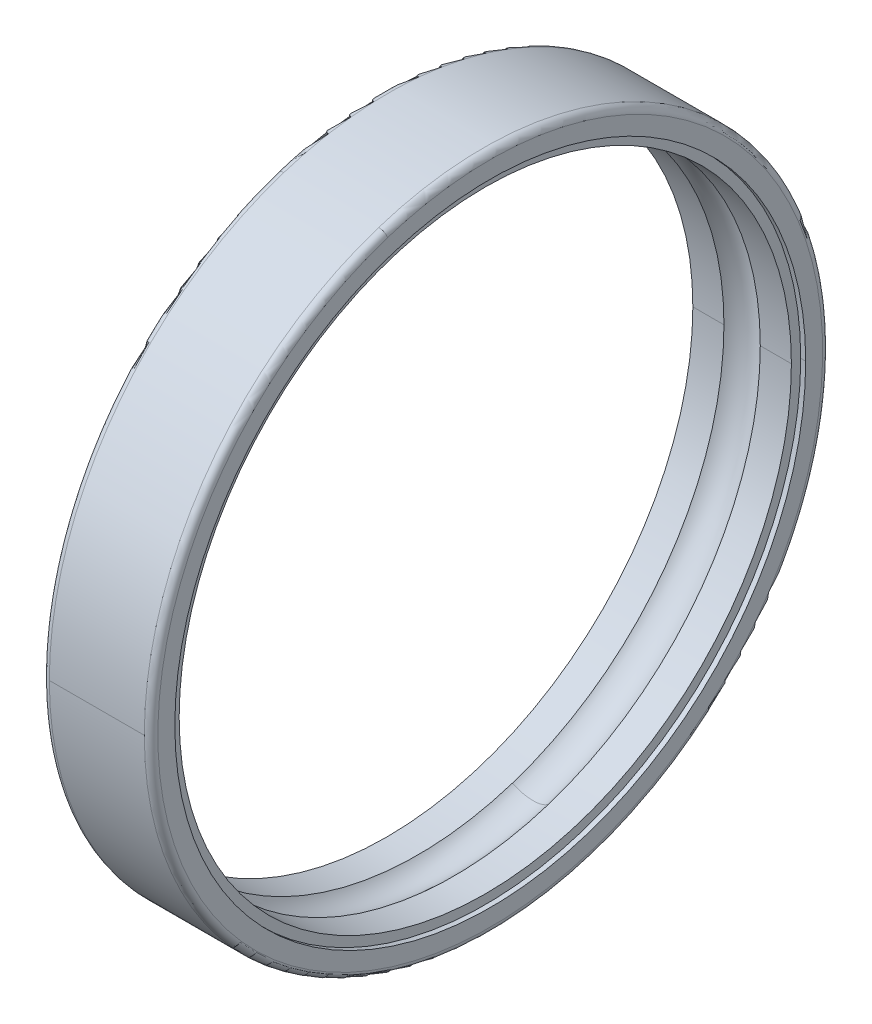
ISO-10303-21;
HEADER;
FILE_DESCRIPTION(('STEP AP214'),'2;1');
FILE_NAME('part.step','',(''),(''),'','','');
FILE_SCHEMA(('AUTOMOTIVE_DESIGN { 1 0 10303 214 1 1 1 1 }'));
ENDSEC;
DATA;
#1=APPLICATION_CONTEXT('core data for automotive mechanical design processes');
#2=APPLICATION_PROTOCOL_DEFINITION('international standard','automotive_design',2000,#1);
#3=PRODUCT_CONTEXT('',#1,'mechanical');
#4=PRODUCT('Part','Part','',(#3));
#5=PRODUCT_RELATED_PRODUCT_CATEGORY('part','',(#4));
#6=PRODUCT_DEFINITION_FORMATION('','',#4);
#7=PRODUCT_DEFINITION_CONTEXT('part definition',#1,'design');
#8=PRODUCT_DEFINITION('design','',#6,#7);
#9=PRODUCT_DEFINITION_SHAPE('','',#8);
#10=(LENGTH_UNIT() NAMED_UNIT(*) SI_UNIT(.MILLI.,.METRE.));
#11=(NAMED_UNIT(*) PLANE_ANGLE_UNIT() SI_UNIT($,.RADIAN.));
#12=(NAMED_UNIT(*) SI_UNIT($,.STERADIAN.) SOLID_ANGLE_UNIT());
#13=UNCERTAINTY_MEASURE_WITH_UNIT(LENGTH_MEASURE(1.E-05),#10,'distance_accuracy_value','');
#14=(GEOMETRIC_REPRESENTATION_CONTEXT(3) GLOBAL_UNCERTAINTY_ASSIGNED_CONTEXT((#13)) GLOBAL_UNIT_ASSIGNED_CONTEXT((#10,
#11,#12)) REPRESENTATION_CONTEXT('',''));
#15=CARTESIAN_POINT('',(0.,0.,0.));
#16=DIRECTION('',(0.,0.,1.));
#17=DIRECTION('',(1.,0.,0.));
#18=AXIS2_PLACEMENT_3D('',#15,#16,#17);
#19=CARTESIAN_POINT('',(0.,49.,0.));
#20=DIRECTION('',(-1.,0.,0.));
#21=DIRECTION('',(0.,0.,1.));
#22=AXIS2_PLACEMENT_3D('',#19,#20,#21);
#23=PLANE('',#22);
#24=CARTESIAN_POINT('',(0.,0.,0.));
#25=DIRECTION('',(1.,0.,0.));
#26=DIRECTION('',(0.,0.,-1.));
#27=AXIS2_PLACEMENT_3D('',#24,#25,#26);
#28=CIRCLE('',#27,46.5);
#29=CARTESIAN_POINT('',(0.,0.,-46.5));
#30=VERTEX_POINT('',#29);
#31=CARTESIAN_POINT('',(0.,0.,46.5));
#32=VERTEX_POINT('',#31);
#33=EDGE_CURVE('E11',#30,#32,#28,.T.);
#34=ORIENTED_EDGE('',*,*,#33,.T.);
#35=CARTESIAN_POINT('',(0.,0.,0.));
#36=DIRECTION('',(1.,0.,0.));
#37=DIRECTION('',(0.,0.,-1.));
#38=AXIS2_PLACEMENT_3D('',#35,#36,#37);
#39=CIRCLE('',#38,46.5);
#40=EDGE_CURVE('E28',#32,#30,#39,.T.);
#41=ORIENTED_EDGE('',*,*,#40,.T.);
#42=EDGE_LOOP('',(#34,#41));
#43=FACE_BOUND('',#42,.T.);
#44=CARTESIAN_POINT('',(0.,46.6017692984632,15.1418327243728));
#45=CARTESIAN_POINT('',(0.,46.3540275646317,15.9043584169981));
#46=CARTESIAN_POINT('',(0.,46.0875394556069,16.6607915214573));
#47=CARTESIAN_POINT('',(0.,45.5177823635672,18.1596768040243));
#48=CARTESIAN_POINT('',(0.,45.2145133805522,18.902128982132));
#49=CARTESIAN_POINT('',(0.,44.5719064169285,20.3712566619767));
#50=CARTESIAN_POINT('',(0.,44.2325684363197,21.0979321637136));
#51=CARTESIAN_POINT('',(0.,43.518645989814,22.5337577730632));
#52=CARTESIAN_POINT('',(0.,43.1440615239171,23.242907880676));
#53=CARTESIAN_POINT('',(0.,42.3605471692183,24.6419737860266));
#54=CARTESIAN_POINT('',(0.,41.9516172804164,25.3318895837645));
#55=CARTESIAN_POINT('',(0.,41.1003975880598,26.6908249387085));
#56=CARTESIAN_POINT('',(0.,40.6581077845053,27.3598444959146));
#57=CARTESIAN_POINT('',(0.,39.7412336809963,28.6753756063925));
#58=CARTESIAN_POINT('',(0.,39.2666493810418,29.3218871596643));
#59=CARTESIAN_POINT('',(0.,38.286329625744,30.5908447691449));
#60=CARTESIAN_POINT('',(0.,37.7805941704005,31.2132908253538));
#61=CARTESIAN_POINT('',(0.,36.7391904584036,32.4326179110054));
#62=CARTESIAN_POINT('',(0.,36.2035222017501,33.029498940448));
#63=CARTESIAN_POINT('',(0.,35.1035433607393,34.1962580345922));
#64=CARTESIAN_POINT('',(0.,34.5392327763819,34.7661360992938));
#65=CARTESIAN_POINT('',(0.,33.3833287530913,35.8775163775936));
#66=CARTESIAN_POINT('',(0.,32.7917353141581,36.4190185911918));
#67=CARTESIAN_POINT('',(0.,31.5826907822608,37.4723426410728));
#68=CARTESIAN_POINT('',(0.,30.9652396892969,37.9841644773557));
#69=CARTESIAN_POINT('',(0.,29.7059673430677,38.9768947489587));
#70=CARTESIAN_POINT('',(0.,29.0641460898025,39.4578031842788));
#71=CARTESIAN_POINT('',(0.,27.7576796265966,40.3875481034166));
#72=CARTESIAN_POINT('',(0.,27.0930344166558,40.8363845872343));
#73=CARTESIAN_POINT('',(0.,25.7425212286229,41.7009043169633));
#74=CARTESIAN_POINT('',(0.,25.0566532505308,42.1165875628746));
#75=CARTESIAN_POINT('',(0.,23.66534684223,42.9137993994422));
#76=CARTESIAN_POINT('',(0.,22.9599084120213,43.2953279900985));
#77=CARTESIAN_POINT('',(0.,21.5311605624548,44.0233113803631));
#78=CARTESIAN_POINT('',(0.,20.8078511430969,44.3697661799714));
#79=CARTESIAN_POINT('',(0.,19.3451038309777,45.026767348182));
#80=CARTESIAN_POINT('',(0.,18.6056659382163,45.3373137167842));
#81=CARTESIAN_POINT('',(0.,17.1124430499408,45.9217498895801));
#82=CARTESIAN_POINT('',(0.,16.3586580544266,46.1956396937737));
#83=CARTESIAN_POINT('',(0.,14.8385568947236,46.7061029132239));
#84=CARTESIAN_POINT('',(0.,14.0722407305346,46.9426763284806));
#85=CARTESIAN_POINT('',(0.,12.5289233562429,47.3779368439784));
#86=CARTESIAN_POINT('',(0.,11.7519221461401,47.5766239442195));
#87=CARTESIAN_POINT('',(0.,10.189106543993,47.9356331750585));
#88=CARTESIAN_POINT('',(0.,9.40329215194865,48.0959553056566));
#89=CARTESIAN_POINT('',(0.,7.8247432816182,48.3778483671544));
#90=CARTESIAN_POINT('',(0.,7.03200880333205,48.4994192980542));
#91=CARTESIAN_POINT('',(0.,5.44152952731147,48.7035170851347));
#92=CARTESIAN_POINT('',(0.,4.64378472957702,48.7860439413154));
#93=CARTESIAN_POINT('',(0.,3.04520665175174,48.9118547645327));
#94=CARTESIAN_POINT('',(0.,2.24437337166092,48.9551387315693));
#95=CARTESIAN_POINT('',(0.,0.641547606639343,49.0023595016304));
#96=CARTESIAN_POINT('',(0.,-0.160444878291403,49.006296304655));
#97=CARTESIAN_POINT('',(0.,-1.76365698285037,48.9748132625889));
#98=CARTESIAN_POINT('',(0.,-2.5648766024786,48.9393934174983));
#99=CARTESIAN_POINT('',(0.,-4.1646127681903,48.8292824087109));
#100=CARTESIAN_POINT('',(0.,-4.96312931427378,48.7545912450142));
#101=CARTESIAN_POINT('',(0.,-6.55553563659467,48.5661175365702));
#102=CARTESIAN_POINT('',(0.,-7.34942541283208,48.452334991823));
#103=CARTESIAN_POINT('',(0.,-8.93066564545337,48.1859526333944));
#104=CARTESIAN_POINT('',(0.,-9.71801610183724,48.0333528197132));
#105=CARTESIAN_POINT('',(0.,-11.2842808985383,47.6897035497339));
#106=CARTESIAN_POINT('',(0.,-12.0631952388554,47.4986540934359));
#107=CARTESIAN_POINT('',(0.,-13.6107113305523,47.0785657930973));
#108=CARTESIAN_POINT('',(0.,-14.379313081932,46.8495269490567));
#109=CARTESIAN_POINT('',(0.,-15.9043523668135,46.3540116478698));
#110=CARTESIAN_POINT('',(0.,-16.6607899003152,46.0875351907234));
#111=CARTESIAN_POINT('',(0.,-18.1596784251663,45.5177866284507));
#112=CARTESIAN_POINT('',(0.,-18.9021294165157,45.2145145233243));
#113=CARTESIAN_POINT('',(0.,-20.3712562275929,44.5719052741564));
#114=CARTESIAN_POINT('',(0.,-21.0979320473208,44.2325681301148));
#115=CARTESIAN_POINT('',(0.,-22.533757889456,43.5186462960189));
#116=CARTESIAN_POINT('',(0.,-23.2429079118633,43.1440616059645));
#117=CARTESIAN_POINT('',(0.,-24.6419737548392,42.360547087171));
#118=CARTESIAN_POINT('',(0.,-25.3318895754078,41.9516172584319));
#119=CARTESIAN_POINT('',(0.,-26.6908249470651,41.1003976100444));
#120=CARTESIAN_POINT('',(0.,-27.3598444981537,40.658107790396));
#121=CARTESIAN_POINT('',(0.,-28.6753756041533,39.7412336751056));
#122=CARTESIAN_POINT('',(0.,-29.3218871590642,39.2666493794635));
#123=CARTESIAN_POINT('',(0.,-30.5908447697449,38.2863296273224));
#124=CARTESIAN_POINT('',(0.,-31.2132908255146,37.7805941708235));
#125=CARTESIAN_POINT('',(0.,-32.4326179108446,36.7391904579807));
#126=CARTESIAN_POINT('',(0.,-33.0294989404049,36.2035222016368));
#127=CARTESIAN_POINT('',(0.,-34.1962580346352,35.1035433608526));
#128=CARTESIAN_POINT('',(0.,-34.7661360993053,34.5392327764123));
#129=CARTESIAN_POINT('',(0.,-35.877516377582,33.383328753061));
#130=CARTESIAN_POINT('',(0.,-36.4190185911886,32.79173531415));
#131=CARTESIAN_POINT('',(0.,-37.4723426410759,31.582690782269));
#132=CARTESIAN_POINT('',(0.,-37.9841644773565,30.9652396892991));
#133=CARTESIAN_POINT('',(0.,-38.9768947489578,29.7059673430655));
#134=CARTESIAN_POINT('',(0.,-39.4578031842786,29.064146089802));
#135=CARTESIAN_POINT('',(0.,-40.3875481034168,27.7576796265972));
#136=CARTESIAN_POINT('',(0.,-40.8363845872343,27.093034416656));
#137=CARTESIAN_POINT('',(0.,-41.7009043169632,25.7425212286228));
#138=CARTESIAN_POINT('',(0.,-42.1165875628746,25.0566532505308));
#139=CARTESIAN_POINT('',(0.,-42.9137993994422,23.6653468422301));
#140=CARTESIAN_POINT('',(0.,-43.2953279900985,22.9599084120214));
#141=CARTESIAN_POINT('',(0.,-44.023311380363,21.5311605624549));
#142=CARTESIAN_POINT('',(0.,-44.3697661799713,20.807851143097));
#143=CARTESIAN_POINT('',(0.,-45.026767348182,19.3451038309777));
#144=CARTESIAN_POINT('',(0.,-45.3373137167844,18.6056659382163));
#145=CARTESIAN_POINT('',(0.,-45.9217498895799,17.1124430499409));
#146=CARTESIAN_POINT('',(0.,-46.195639693773,16.3586580544268));
#147=CARTESIAN_POINT('',(0.,-46.7061029132245,14.8385568947234));
#148=CARTESIAN_POINT('',(0.,-46.9426763284829,14.0722407305341));
#149=CARTESIAN_POINT('',(0.,-47.3779368439761,12.5289233562436));
#150=CARTESIAN_POINT('',(0.,-47.5766239442111,11.7519221461424));
#151=CARTESIAN_POINT('',(0.,-47.9356331750669,10.1891065439907));
#152=CARTESIAN_POINT('',(0.,-48.0959553056879,9.4032921519402));
#153=CARTESIAN_POINT('',(0.,-48.3778483671231,7.82474328162676));
#154=CARTESIAN_POINT('',(0.,-48.4994192979372,7.03200880336386));
#155=CARTESIAN_POINT('',(0.,-48.7035170852517,5.44152952727973));
#156=CARTESIAN_POINT('',(0.,-48.7860439417521,4.64378472945851));
#157=CARTESIAN_POINT('',(0.,-48.911854764096,3.04520665187031));
#158=CARTESIAN_POINT('',(0.,-48.9551387299396,2.24437337210333));
#159=CARTESIAN_POINT('',(0.,-49.00235950326,0.641547606197012));
#160=CARTESIAN_POINT('',(0.,-49.0062963107369,-0.160444879942331));
#161=CARTESIAN_POINT('',(0.,-48.9748132565071,-1.76365698119935));
#162=CARTESIAN_POINT('',(0.,-48.9393933948005,-2.56487659631703));
#163=CARTESIAN_POINT('',(0.,-48.8292824314086,-4.16461277435179));
#164=CARTESIAN_POINT('',(0.,-48.7545913297233,-4.96312933726887));
#165=CARTESIAN_POINT('',(0.,-48.566117451861,-6.55553561359952));
#166=CARTESIAN_POINT('',(0.,-48.4523346756841,-7.34942532701308));
#167=CARTESIAN_POINT('',(0.,-48.1859529495333,-8.93066573127231));
#168=CARTESIAN_POINT('',(0.,-48.0333539995595,-9.71801642211798));
#169=CARTESIAN_POINT('',(0.,-47.6897023698875,-11.2842805782574));
#170=CARTESIAN_POINT('',(0.,-47.4986496901892,-12.0631940435512));
#171=CARTESIAN_POINT('',(0.,-47.0785701963439,-13.6107125258564));
#172=CARTESIAN_POINT('',(0.,-46.8495433821969,-14.3793175428678));
#173=CARTESIAN_POINT('',(0.,-46.6017692984633,-15.1418327243727));
#174=B_SPLINE_CURVE_WITH_KNOTS('',3,(#44,#45,#46,#47,#48,#49,#50,#51,#52,#53,#54,#55,#56,#57,
#58,#59,#60,#61,#62,#63,#64,#65,#66,#67,#68,#69,#70,#71,#72,#73,#74,#75,#76,#77,#78,#79,#80,#81,
#82,#83,#84,#85,#86,#87,#88,#89,#90,#91,#92,#93,#94,#95,#96,#97,#98,#99,#100,#101,#102,#103,
#104,#105,#106,#107,#108,#109,#110,#111,#112,#113,#114,#115,#116,#117,#118,#119,#120,#121,#122,
#123,#124,#125,#126,#127,#128,#129,#130,#131,#132,#133,#134,#135,#136,#137,#138,#139,#140,#141,
#142,#143,#144,#145,#146,#147,#148,#149,#150,#151,#152,#153,#154,#155,#156,#157,#158,#159,#160,
#161,#162,#163,#164,#165,#166,#167,#168,#169,#170,#171,#172,#173),.UNSPECIFIED.,.F.,.F.,(4,2,2,
2,2,2,2,2,2,2,2,2,2,2,2,2,2,2,2,2,2,2,2,2,2,2,2,2,2,2,2,2,2,2,2,2,2,2,2,2,2,2,2,2,2,2,2,2,2,2,2,
2,2,2,2,2,2,2,2,2,2,2,2,2,4),(0.,2.40504039524543,4.81008079049088,7.21512118573632,
9.62016158098177,12.0252019762272,14.4302423714727,16.8352827667181,19.2403231619636,
21.645363557209,24.0504039524544,26.4554443476999,28.8604847429453,31.2655251381908,
33.6705655334362,36.0756059286816,38.4806463239271,40.8856867191725,43.290727114418,
45.6957675096634,48.1008079049088,50.5058483001543,52.9108886953997,55.3159290906452,
57.7209694858906,60.1260098811361,62.5310502763815,64.9360906716269,67.3411310668724,
69.7461714621178,72.1512118573633,74.5562522526087,76.9612926478542,79.3663330430996,
81.771373438345,84.1764138335905,86.5814542288359,88.9864946240814,91.3915350193268,
93.7965754145722,96.2016158098177,98.6066562050631,101.011696600309,103.416736995554,
105.821777390799,108.226817786045,110.63185818129,113.036898576536,115.441938971781,
117.846979367027,120.252019762272,122.657060157518,125.062100552763,127.467140948008,
129.872181343254,132.277221738499,134.682262133745,137.08730252899,139.492342924236,
141.897383319481,144.302423714727,146.707464109972,149.112504505217,151.517544900463,
153.922585295708),.UNSPECIFIED.);
#175=CARTESIAN_POINT('',(0.,46.6017692984633,15.1418327243727));
#176=VERTEX_POINT('',#175);
#177=CARTESIAN_POINT('',(0.,-46.6017692984633,-15.1418327243727));
#178=VERTEX_POINT('',#177);
#179=EDGE_CURVE('E320',#176,#178,#174,.T.);
#180=ORIENTED_EDGE('',*,*,#179,.F.);
#181=CARTESIAN_POINT('',(0.,-46.6017692984632,-15.1418327243728));
#182=CARTESIAN_POINT('',(0.,-46.3540275646317,-15.9043584169981));
#183=CARTESIAN_POINT('',(0.,-46.0875394556069,-16.6607915214573));
#184=CARTESIAN_POINT('',(0.,-45.5177823635672,-18.1596768040243));
#185=CARTESIAN_POINT('',(0.,-45.2145133805522,-18.902128982132));
#186=CARTESIAN_POINT('',(0.,-44.5719064169285,-20.3712566619767));
#187=CARTESIAN_POINT('',(0.,-44.2325684363197,-21.0979321637136));
#188=CARTESIAN_POINT('',(0.,-43.518645989814,-22.5337577730632));
#189=CARTESIAN_POINT('',(0.,-43.1440615239171,-23.242907880676));
#190=CARTESIAN_POINT('',(0.,-42.3605471692183,-24.6419737860266));
#191=CARTESIAN_POINT('',(0.,-41.9516172804164,-25.3318895837645));
#192=CARTESIAN_POINT('',(0.,-41.1003975880598,-26.6908249387085));
#193=CARTESIAN_POINT('',(0.,-40.6581077845053,-27.3598444959146));
#194=CARTESIAN_POINT('',(0.,-39.7412336809963,-28.6753756063925));
#195=CARTESIAN_POINT('',(0.,-39.2666493810419,-29.3218871596642));
#196=CARTESIAN_POINT('',(0.,-38.286329625744,-30.5908447691449));
#197=CARTESIAN_POINT('',(0.,-37.7805941704005,-31.2132908253538));
#198=CARTESIAN_POINT('',(0.,-36.7391904584036,-32.4326179110054));
#199=CARTESIAN_POINT('',(0.,-36.2035222017501,-33.029498940448));
#200=CARTESIAN_POINT('',(0.,-35.1035433607393,-34.1962580345922));
#201=CARTESIAN_POINT('',(0.,-34.5392327763819,-34.7661360992938));
#202=CARTESIAN_POINT('',(0.,-33.3833287530914,-35.8775163775935));
#203=CARTESIAN_POINT('',(0.,-32.7917353141581,-36.4190185911917));
#204=CARTESIAN_POINT('',(0.,-31.5826907822609,-37.4723426410728));
#205=CARTESIAN_POINT('',(0.,-30.9652396892969,-37.9841644773557));
#206=CARTESIAN_POINT('',(0.,-29.7059673430677,-38.9768947489587));
#207=CARTESIAN_POINT('',(0.,-29.0641460898026,-39.4578031842788));
#208=CARTESIAN_POINT('',(0.,-27.7576796265966,-40.3875481034166));
#209=CARTESIAN_POINT('',(0.,-27.0930344166559,-40.8363845872342));
#210=CARTESIAN_POINT('',(0.,-25.7425212286229,-41.7009043169632));
#211=CARTESIAN_POINT('',(0.,-25.0566532505308,-42.1165875628746));
#212=CARTESIAN_POINT('',(0.,-23.66534684223,-42.9137993994422));
#213=CARTESIAN_POINT('',(0.,-22.9599084120214,-43.2953279900985));
#214=CARTESIAN_POINT('',(0.,-21.5311605624549,-44.0233113803631));
#215=CARTESIAN_POINT('',(0.,-20.807851143097,-44.3697661799714));
#216=CARTESIAN_POINT('',(0.,-19.3451038309777,-45.0267673481819));
#217=CARTESIAN_POINT('',(0.,-18.6056659382163,-45.3373137167842));
#218=CARTESIAN_POINT('',(0.,-17.1124430499408,-45.9217498895801));
#219=CARTESIAN_POINT('',(0.,-16.3586580544267,-46.1956396937736));
#220=CARTESIAN_POINT('',(0.,-14.8385568947236,-46.7061029132239));
#221=CARTESIAN_POINT('',(0.,-14.0722407305347,-46.9426763284806));
#222=CARTESIAN_POINT('',(0.,-12.5289233562429,-47.3779368439784));
#223=CARTESIAN_POINT('',(0.,-11.7519221461401,-47.5766239442194));
#224=CARTESIAN_POINT('',(0.,-10.189106543993,-47.9356331750585));
#225=CARTESIAN_POINT('',(0.,-9.40329215194871,-48.0959553056566));
#226=CARTESIAN_POINT('',(0.,-7.82474328161827,-48.3778483671544));
#227=CARTESIAN_POINT('',(0.,-7.03200880333212,-48.4994192980542));
#228=CARTESIAN_POINT('',(0.,-5.44152952731154,-48.7035170851347));
#229=CARTESIAN_POINT('',(0.,-4.64378472957709,-48.7860439413154));
#230=CARTESIAN_POINT('',(0.,-3.04520665175181,-48.9118547645327));
#231=CARTESIAN_POINT('',(0.,-2.24437337166097,-48.9551387315693));
#232=CARTESIAN_POINT('',(0.,-0.641547606639399,-49.0023595016304));
#233=CARTESIAN_POINT('',(0.,0.16044487829134,-49.006296304655));
#234=CARTESIAN_POINT('',(0.,1.7636569828503,-48.9748132625889));
#235=CARTESIAN_POINT('',(0.,2.56487660247853,-48.9393934174983));
#236=CARTESIAN_POINT('',(0.,4.16461276819022,-48.8292824087109));
#237=CARTESIAN_POINT('',(0.,4.96312931427369,-48.7545912450141));
#238=CARTESIAN_POINT('',(0.,6.55553563659458,-48.5661175365702));
#239=CARTESIAN_POINT('',(0.,7.34942541283199,-48.452334991823));
#240=CARTESIAN_POINT('',(0.,8.93066564545328,-48.1859526333945));
#241=CARTESIAN_POINT('',(0.,9.71801610183715,-48.0333528197132));
#242=CARTESIAN_POINT('',(0.,11.2842808985382,-47.6897035497339));
#243=CARTESIAN_POINT('',(0.,12.0631952388553,-47.4986540934359));
#244=CARTESIAN_POINT('',(0.,13.6107113305522,-47.0785657930973));
#245=CARTESIAN_POINT('',(0.,14.3793130819319,-46.8495269490568));
#246=CARTESIAN_POINT('',(0.,15.9043523668134,-46.3540116478698));
#247=CARTESIAN_POINT('',(0.,16.6607899003151,-46.0875351907235));
#248=CARTESIAN_POINT('',(0.,18.1596784251662,-45.5177866284507));
#249=CARTESIAN_POINT('',(0.,18.9021294165156,-45.2145145233244));
#250=CARTESIAN_POINT('',(0.,20.3712562275928,-44.5719052741564));
#251=CARTESIAN_POINT('',(0.,21.0979320473207,-44.2325681301148));
#252=CARTESIAN_POINT('',(0.,22.5337578894559,-43.5186462960189));
#253=CARTESIAN_POINT('',(0.,23.2429079118632,-43.1440616059645));
#254=CARTESIAN_POINT('',(0.,24.6419737548391,-42.360547087171));
#255=CARTESIAN_POINT('',(0.,25.3318895754077,-41.9516172584319));
#256=CARTESIAN_POINT('',(0.,26.690824947065,-41.1003976100445));
#257=CARTESIAN_POINT('',(0.,27.3598444981536,-40.6581077903961));
#258=CARTESIAN_POINT('',(0.,28.6753756041532,-39.7412336751056));
#259=CARTESIAN_POINT('',(0.,29.3218871590641,-39.2666493794635));
#260=CARTESIAN_POINT('',(0.,30.5908447697448,-38.2863296273225));
#261=CARTESIAN_POINT('',(0.,31.2132908255145,-37.7805941708236));
#262=CARTESIAN_POINT('',(0.,32.4326179108445,-36.7391904579807));
#263=CARTESIAN_POINT('',(0.,33.0294989404048,-36.2035222016369));
#264=CARTESIAN_POINT('',(0.,34.1962580346351,-35.1035433608527));
#265=CARTESIAN_POINT('',(0.,34.7661360993052,-34.5392327764124));
#266=CARTESIAN_POINT('',(0.,35.8775163775819,-33.3833287530611));
#267=CARTESIAN_POINT('',(0.,36.4190185911885,-32.7917353141501));
#268=CARTESIAN_POINT('',(0.,37.4723426410758,-31.5826907822691));
#269=CARTESIAN_POINT('',(0.,37.9841644773564,-30.9652396892992));
#270=CARTESIAN_POINT('',(0.,38.9768947489578,-29.7059673430656));
#271=CARTESIAN_POINT('',(0.,39.4578031842785,-29.0641460898021));
#272=CARTESIAN_POINT('',(0.,40.3875481034167,-27.7576796265973));
#273=CARTESIAN_POINT('',(0.,40.8363845872342,-27.0930344166561));
#274=CARTESIAN_POINT('',(0.,41.7009043169631,-25.7425212286229));
#275=CARTESIAN_POINT('',(0.,42.1165875628745,-25.0566532505309));
#276=CARTESIAN_POINT('',(0.,42.9137993994421,-23.6653468422302));
#277=CARTESIAN_POINT('',(0.,43.2953279900984,-22.9599084120215));
#278=CARTESIAN_POINT('',(0.,44.023311380363,-21.531160562455));
#279=CARTESIAN_POINT('',(0.,44.3697661799713,-20.8078511430971));
#280=CARTESIAN_POINT('',(0.,45.026767348182,-19.3451038309778));
#281=CARTESIAN_POINT('',(0.,45.3373137167843,-18.6056659382164));
#282=CARTESIAN_POINT('',(0.,45.9217498895798,-17.112443049941));
#283=CARTESIAN_POINT('',(0.,46.195639693773,-16.358658054427));
#284=CARTESIAN_POINT('',(0.,46.7061029132245,-14.8385568947236));
#285=CARTESIAN_POINT('',(0.,46.9426763284828,-14.0722407305342));
#286=CARTESIAN_POINT('',(0.,47.3779368439761,-12.5289233562437));
#287=CARTESIAN_POINT('',(0.,47.576623944211,-11.7519221461425));
#288=CARTESIAN_POINT('',(0.,47.9356331750669,-10.1891065439909));
#289=CARTESIAN_POINT('',(0.,48.0959553056879,-9.40329215194033));
#290=CARTESIAN_POINT('',(0.,48.377848367123,-7.82474328162691));
#291=CARTESIAN_POINT('',(0.,48.4994192979372,-7.03200880336402));
#292=CARTESIAN_POINT('',(0.,48.7035170852517,-5.44152952727991));
#293=CARTESIAN_POINT('',(0.,48.7860439417521,-4.64378472945869));
#294=CARTESIAN_POINT('',(0.,48.911854764096,-3.04520665187049));
#295=CARTESIAN_POINT('',(0.,48.9551387299396,-2.24437337210351));
#296=CARTESIAN_POINT('',(0.,49.00235950326,-0.641547606197191));
#297=CARTESIAN_POINT('',(0.,49.0062963107369,0.16044487994215));
#298=CARTESIAN_POINT('',(0.,48.9748132565071,1.76365698119917));
#299=CARTESIAN_POINT('',(0.,48.9393933948005,2.56487659631685));
#300=CARTESIAN_POINT('',(0.,48.8292824314086,4.16461277435161));
#301=CARTESIAN_POINT('',(0.,48.7545913297233,4.96312933726869));
#302=CARTESIAN_POINT('',(0.,48.5661174518611,6.55553561359934));
#303=CARTESIAN_POINT('',(0.,48.4523346756841,7.3494253270129));
#304=CARTESIAN_POINT('',(0.,48.1859529495334,8.93066573127214));
#305=CARTESIAN_POINT('',(0.,48.0333539995596,9.71801642211781));
#306=CARTESIAN_POINT('',(0.,47.6897023698875,11.2842805782573));
#307=CARTESIAN_POINT('',(0.,47.4986496901893,12.063194043551));
#308=CARTESIAN_POINT('',(0.,47.078570196344,13.6107125258562));
#309=CARTESIAN_POINT('',(0.,46.8495433821969,14.3793175428676));
#310=CARTESIAN_POINT('',(0.,46.6017692984633,15.1418327243725));
#311=B_SPLINE_CURVE_WITH_KNOTS('',3,(#181,#182,#183,#184,#185,#186,#187,#188,#189,#190,#191,
#192,#193,#194,#195,#196,#197,#198,#199,#200,#201,#202,#203,#204,#205,#206,#207,#208,#209,#210,
#211,#212,#213,#214,#215,#216,#217,#218,#219,#220,#221,#222,#223,#224,#225,#226,#227,#228,#229,
#230,#231,#232,#233,#234,#235,#236,#237,#238,#239,#240,#241,#242,#243,#244,#245,#246,#247,#248,
#249,#250,#251,#252,#253,#254,#255,#256,#257,#258,#259,#260,#261,#262,#263,#264,#265,#266,#267,
#268,#269,#270,#271,#272,#273,#274,#275,#276,#277,#278,#279,#280,#281,#282,#283,#284,#285,#286,
#287,#288,#289,#290,#291,#292,#293,#294,#295,#296,#297,#298,#299,#300,#301,#302,#303,#304,#305,
#306,#307,#308,#309,#310),.UNSPECIFIED.,.F.,.F.,(4,2,2,2,2,2,2,2,2,2,2,2,2,2,2,2,2,2,2,2,2,2,2,
2,2,2,2,2,2,2,2,2,2,2,2,2,2,2,2,2,2,2,2,2,2,2,2,2,2,2,2,2,2,2,2,2,2,2,2,2,2,2,2,2,4),(0.,
2.40504039524543,4.81008079049088,7.21512118573632,9.62016158098176,12.0252019762272,
14.4302423714726,16.8352827667181,19.2403231619635,21.645363557209,24.0504039524544,
26.4554443476998,28.8604847429453,31.2655251381907,33.6705655334361,36.0756059286816,
38.480646323927,40.8856867191725,43.2907271144179,45.6957675096633,48.1008079049088,
50.5058483001542,52.9108886953997,55.3159290906451,57.7209694858905,60.126009881136,
62.5310502763814,64.9360906716269,67.3411310668723,69.7461714621177,72.1512118573632,
74.5562522526086,76.9612926478541,79.3663330430995,81.7713734383449,84.1764138335904,
86.5814542288358,88.9864946240812,91.3915350193267,93.7965754145721,96.2016158098176,
98.606656205063,101.011696600308,103.416736995554,105.821777390799,108.226817786045,
110.63185818129,113.036898576536,115.441938971781,117.846979367027,120.252019762272,
122.657060157517,125.062100552763,127.467140948008,129.872181343254,132.277221738499,
134.682262133745,137.08730252899,139.492342924236,141.897383319481,144.302423714726,
146.707464109972,149.112504505217,151.517544900463,153.922585295708),.UNSPECIFIED.);
#312=EDGE_CURVE('E422',#178,#176,#311,.T.);
#313=ORIENTED_EDGE('',*,*,#312,.F.);
#314=EDGE_LOOP('',(#180,#313));
#315=FACE_BOUND('',#314,.T.);
#316=ADVANCED_FACE('F19',(#43,#315),#23,.T.);
#317=CARTESIAN_POINT('',(0.999999999999218,0.,0.));
#318=DIRECTION('',(1.,0.,0.));
#319=DIRECTION('',(0.,-0.309016994374947,0.951056516295154));
#320=AXIS2_PLACEMENT_3D('',#317,#318,#319);
#321=TOROIDAL_SURFACE('',#320,49.0000000000008,0.999999999999217);
#322=CARTESIAN_POINT('',(0.999999999999218,-46.6017692984633,-15.1418327243727));
#323=DIRECTION('',(0.,0.309016994374947,-0.951056516295154));
#324=DIRECTION('',(7.81819053941643E-13,-0.951056516295154,-0.309016994374947));
#325=AXIS2_PLACEMENT_3D('',#322,#323,#324);
#326=CIRCLE('',#325,0.999999999999223);
#327=CARTESIAN_POINT('',(1.,-47.5528258147577,-15.4508497187474));
#328=VERTEX_POINT('',#327);
#329=EDGE_CURVE('E385',#328,#178,#326,.T.);
#330=ORIENTED_EDGE('',*,*,#329,.T.);
#331=ORIENTED_EDGE('',*,*,#312,.T.);
#332=CARTESIAN_POINT('',(0.999999999999218,46.6017692984633,15.1418327243727));
#333=DIRECTION('',(0.,-0.309016994374947,0.951056516295154));
#334=DIRECTION('',(7.81819053941643E-13,0.951056516295154,0.309016994374947));
#335=AXIS2_PLACEMENT_3D('',#332,#333,#334);
#336=CIRCLE('',#335,0.999999999999223);
#337=CARTESIAN_POINT('',(1.,47.5528258147577,15.4508497187474));
#338=VERTEX_POINT('',#337);
#339=EDGE_CURVE('E381',#338,#176,#336,.T.);
#340=ORIENTED_EDGE('',*,*,#339,.F.);
#341=CARTESIAN_POINT('',(1.,0.,0.));
#342=DIRECTION('',(1.,0.,0.));
#343=DIRECTION('',(0.,0.,-1.));
#344=AXIS2_PLACEMENT_3D('',#341,#342,#343);
#345=CIRCLE('',#344,50.);
#346=CARTESIAN_POINT('',(1.,0.,-50.));
#347=VERTEX_POINT('',#346);
#348=EDGE_CURVE('E376',#347,#338,#345,.T.);
#349=ORIENTED_EDGE('',*,*,#348,.F.);
#350=CARTESIAN_POINT('',(1.,0.,0.));
#351=DIRECTION('',(1.,0.,0.));
#352=DIRECTION('',(0.,0.,-1.));
#353=AXIS2_PLACEMENT_3D('',#350,#351,#352);
#354=CIRCLE('',#353,50.);
#355=EDGE_CURVE('E371',#328,#347,#354,.T.);
#356=ORIENTED_EDGE('',*,*,#355,.F.);
#357=EDGE_LOOP('',(#330,#331,#340,#349,#356));
#358=FACE_BOUND('',#357,.T.);
#359=ADVANCED_FACE('F393',(#358),#321,.T.);
#360=CARTESIAN_POINT('',(16.,0.,0.));
#361=DIRECTION('',(1.,0.,0.));
#362=DIRECTION('',(0.,1.,0.));
#363=AXIS2_PLACEMENT_3D('',#360,#361,#362);
#364=CYLINDRICAL_SURFACE('',#363,50.);
#365=DIRECTION('',(1.,0.,0.));
#366=VECTOR('',#365,1.);
#367=CARTESIAN_POINT('',(1.,0.,50.));
#368=LINE('',#367,#366);
#369=CARTESIAN_POINT('',(1.,0.,50.));
#370=VERTEX_POINT('',#369);
#371=CARTESIAN_POINT('',(15.,0.,50.));
#372=VERTEX_POINT('',#371);
#373=EDGE_CURVE('E366',#370,#372,#368,.T.);
#374=ORIENTED_EDGE('',*,*,#373,.F.);
#375=CARTESIAN_POINT('',(1.,0.,0.));
#376=DIRECTION('',(1.,0.,0.));
#377=DIRECTION('',(0.,0.,-1.));
#378=AXIS2_PLACEMENT_3D('',#375,#376,#377);
#379=CIRCLE('',#378,50.);
#380=EDGE_CURVE('E361',#370,#328,#379,.T.);
#381=ORIENTED_EDGE('',*,*,#380,.T.);
#382=ORIENTED_EDGE('',*,*,#355,.T.);
#383=DIRECTION('',(1.,0.,0.));
#384=VECTOR('',#383,1.);
#385=CARTESIAN_POINT('',(1.,0.,-50.));
#386=LINE('',#385,#384);
#387=CARTESIAN_POINT('',(15.,0.,-50.));
#388=VERTEX_POINT('',#387);
#389=EDGE_CURVE('E357',#347,#388,#386,.T.);
#390=ORIENTED_EDGE('',*,*,#389,.T.);
#391=CARTESIAN_POINT('',(15.,0.,0.));
#392=DIRECTION('',(1.,0.,0.));
#393=DIRECTION('',(0.,0.,-1.));
#394=AXIS2_PLACEMENT_3D('',#391,#392,#393);
#395=CIRCLE('',#394,50.);
#396=CARTESIAN_POINT('',(15.,-47.5528258147577,-15.4508497187474));
#397=VERTEX_POINT('',#396);
#398=EDGE_CURVE('E352',#397,#388,#395,.T.);
#399=ORIENTED_EDGE('',*,*,#398,.F.);
#400=CARTESIAN_POINT('',(15.,0.,0.));
#401=DIRECTION('',(1.,0.,0.));
#402=DIRECTION('',(0.,0.,-1.));
#403=AXIS2_PLACEMENT_3D('',#400,#401,#402);
#404=CIRCLE('',#403,50.);
#405=EDGE_CURVE('E347',#372,#397,#404,.T.);
#406=ORIENTED_EDGE('',*,*,#405,.F.);
#407=EDGE_LOOP('',(#374,#381,#382,#390,#399,#406));
#408=FACE_BOUND('',#407,.T.);
#409=ADVANCED_FACE('F402',(#408),#364,.T.);
#410=CARTESIAN_POINT('',(15.0000000000016,0.,0.));
#411=DIRECTION('',(1.,0.,0.));
#412=DIRECTION('',(0.,0.309016994374947,-0.951056516295154));
#413=AXIS2_PLACEMENT_3D('',#410,#411,#412);
#414=TOROIDAL_SURFACE('',#413,49.0000000000016,0.999999999998448);
#415=CARTESIAN_POINT('',(15.0000000000016,-46.601769298464,-15.1418327243729));
#416=DIRECTION('',(0.,0.309016994374947,-0.951056516295154));
#417=DIRECTION('',(1.,0.,0.));
#418=AXIS2_PLACEMENT_3D('',#415,#416,#417);
#419=CIRCLE('',#418,0.999999999998447);
#420=CARTESIAN_POINT('',(16.,-46.601769298464,-15.1418327243729));
#421=VERTEX_POINT('',#420);
#422=EDGE_CURVE('E343',#421,#397,#419,.T.);
#423=ORIENTED_EDGE('',*,*,#422,.F.);
#424=CARTESIAN_POINT('',(16.,0.,0.));
#425=DIRECTION('',(1.,0.,0.));
#426=DIRECTION('',(0.,0.,-1.));
#427=AXIS2_PLACEMENT_3D('',#424,#425,#426);
#428=CIRCLE('',#427,49.);
#429=CARTESIAN_POINT('',(16.,46.601769298464,15.1418327243729));
#430=VERTEX_POINT('',#429);
#431=EDGE_CURVE('E338',#430,#421,#428,.T.);
#432=ORIENTED_EDGE('',*,*,#431,.F.);
#433=CARTESIAN_POINT('',(15.0000000000016,46.601769298464,15.1418327243729));
#434=DIRECTION('',(0.,-0.309016994374947,0.951056516295154));
#435=DIRECTION('',(1.,0.,0.));
#436=AXIS2_PLACEMENT_3D('',#433,#434,#435);
#437=CIRCLE('',#436,0.999999999998447);
#438=CARTESIAN_POINT('',(15.,47.5528258147577,15.4508497187474));
#439=VERTEX_POINT('',#438);
#440=EDGE_CURVE('E334',#430,#439,#437,.T.);
#441=ORIENTED_EDGE('',*,*,#440,.T.);
#442=CARTESIAN_POINT('',(15.,0.,0.));
#443=DIRECTION('',(1.,0.,0.));
#444=DIRECTION('',(0.,0.,-1.));
#445=AXIS2_PLACEMENT_3D('',#442,#443,#444);
#446=CIRCLE('',#445,50.);
#447=EDGE_CURVE('E329',#439,#372,#446,.T.);
#448=ORIENTED_EDGE('',*,*,#447,.T.);
#449=ORIENTED_EDGE('',*,*,#405,.T.);
#450=EDGE_LOOP('',(#423,#432,#441,#448,#449));
#451=FACE_BOUND('',#450,.T.);
#452=ADVANCED_FACE('F406',(#451),#414,.T.);
#453=CARTESIAN_POINT('',(16.,0.,0.));
#454=DIRECTION('',(1.,0.,0.));
#455=DIRECTION('',(0.,-1.,0.));
#456=AXIS2_PLACEMENT_3D('',#453,#454,#455);
#457=CYLINDRICAL_SURFACE('',#456,50.);
#458=ORIENTED_EDGE('',*,*,#373,.T.);
#459=ORIENTED_EDGE('',*,*,#447,.F.);
#460=CARTESIAN_POINT('',(15.,0.,0.));
#461=DIRECTION('',(1.,0.,0.));
#462=DIRECTION('',(0.,0.,-1.));
#463=AXIS2_PLACEMENT_3D('',#460,#461,#462);
#464=CIRCLE('',#463,50.);
#465=EDGE_CURVE('E324',#388,#439,#464,.T.);
#466=ORIENTED_EDGE('',*,*,#465,.F.);
#467=ORIENTED_EDGE('',*,*,#389,.F.);
#468=ORIENTED_EDGE('',*,*,#348,.T.);
#469=CARTESIAN_POINT('',(1.,0.,0.));
#470=DIRECTION('',(1.,0.,0.));
#471=DIRECTION('',(0.,0.,-1.));
#472=AXIS2_PLACEMENT_3D('',#469,#470,#471);
#473=CIRCLE('',#472,50.);
#474=EDGE_CURVE('E321',#338,#370,#473,.T.);
#475=ORIENTED_EDGE('',*,*,#474,.T.);
#476=EDGE_LOOP('',(#458,#459,#466,#467,#468,#475));
#477=FACE_BOUND('',#476,.T.);
#478=ADVANCED_FACE('F409',(#477),#457,.T.);
#479=CARTESIAN_POINT('',(0.999999999999218,0.,0.));
#480=DIRECTION('',(1.,0.,0.));
#481=DIRECTION('',(0.,0.309016994374947,-0.951056516295154));
#482=AXIS2_PLACEMENT_3D('',#479,#480,#481);
#483=TOROIDAL_SURFACE('',#482,49.0000000000008,0.999999999999217);
#484=ORIENTED_EDGE('',*,*,#329,.F.);
#485=ORIENTED_EDGE('',*,*,#380,.F.);
#486=ORIENTED_EDGE('',*,*,#474,.F.);
#487=ORIENTED_EDGE('',*,*,#339,.T.);
#488=ORIENTED_EDGE('',*,*,#179,.T.);
#489=EDGE_LOOP('',(#484,#485,#486,#487,#488));
#490=FACE_BOUND('',#489,.T.);
#491=ADVANCED_FACE('F291',(#490),#483,.T.);
#492=CARTESIAN_POINT('',(15.0000000000016,0.,0.));
#493=DIRECTION('',(1.,0.,0.));
#494=DIRECTION('',(0.,-0.309016994374947,0.951056516295154));
#495=AXIS2_PLACEMENT_3D('',#492,#493,#494);
#496=TOROIDAL_SURFACE('',#495,49.0000000000016,0.999999999998448);
#497=ORIENTED_EDGE('',*,*,#422,.T.);
#498=ORIENTED_EDGE('',*,*,#398,.T.);
#499=ORIENTED_EDGE('',*,*,#465,.T.);
#500=ORIENTED_EDGE('',*,*,#440,.F.);
#501=CARTESIAN_POINT('',(16.,-46.6017692984625,-15.1418327243724));
#502=CARTESIAN_POINT('',(16.,-44.2231991716009,-22.461953035061));
#503=CARTESIAN_POINT('',(16.,-40.4079187715617,-29.3154861228715));
#504=CARTESIAN_POINT('',(16.,-35.2755850243112,-35.3243530181308));
#505=CARTESIAN_POINT('',(16.,-22.9315077882256,-45.0056009216608));
#506=CARTESIAN_POINT('',(16.,-7.84353734818875,-49.3017238794677));
#507=CARTESIAN_POINT('',(16.,0.0344860624711743,-49.9217512023752));
#508=CARTESIAN_POINT('',(16.,15.6087377601282,-48.0387552404326));
#509=CARTESIAN_POINT('',(16.,29.315369314762,-40.4078155106097));
#510=CARTESIAN_POINT('',(16.,35.324381219646,-35.2756168914));
#511=CARTESIAN_POINT('',(16.,45.0056079996287,-22.9314938969314));
#512=CARTESIAN_POINT('',(16.,49.3016815220167,-7.84353326368846));
#513=CARTESIAN_POINT('',(16.,49.9219034003243,0.0344522579902851));
#514=CARTESIAN_POINT('',(16.,48.980124407148,7.82164255004331));
#515=CARTESIAN_POINT('',(16.,46.6017692984625,15.1418327243724));
#516=B_SPLINE_CURVE_WITH_KNOTS('',5,(#501,#502,#503,#504,#505,#506,#507,#508,#509,#510,#511,
#512,#513,#514,#515),.UNSPECIFIED.,.F.,.F.,(6,3,3,3,6),(0.,0.785398163397448,1.5707963267949,
2.35619449019234,3.14159265358979),.UNSPECIFIED.);
#517=EDGE_CURVE('E265',#421,#430,#516,.T.);
#518=ORIENTED_EDGE('',*,*,#517,.F.);
#519=EDGE_LOOP('',(#497,#498,#499,#500,#518));
#520=FACE_BOUND('',#519,.T.);
#521=ADVANCED_FACE('F285',(#520),#496,.T.);
#522=CARTESIAN_POINT('',(16.,46.5,0.));
#523=DIRECTION('',(1.,0.,0.));
#524=DIRECTION('',(0.,0.,-1.));
#525=AXIS2_PLACEMENT_3D('',#522,#523,#524);
#526=PLANE('',#525);
#527=ORIENTED_EDGE('',*,*,#431,.T.);
#528=ORIENTED_EDGE('',*,*,#517,.T.);
#529=EDGE_LOOP('',(#527,#528));
#530=FACE_BOUND('',#529,.T.);
#531=CARTESIAN_POINT('',(16.,0.,0.));
#532=DIRECTION('',(1.,0.,0.));
#533=DIRECTION('',(0.,0.,-1.));
#534=AXIS2_PLACEMENT_3D('',#531,#532,#533);
#535=CIRCLE('',#534,46.5);
#536=CARTESIAN_POINT('',(16.,0.,46.5));
#537=VERTEX_POINT('',#536);
#538=CARTESIAN_POINT('',(16.,0.,-46.5));
#539=VERTEX_POINT('',#538);
#540=EDGE_CURVE('E260',#537,#539,#535,.T.);
#541=ORIENTED_EDGE('',*,*,#540,.F.);
#542=CARTESIAN_POINT('',(16.,0.,0.));
#543=DIRECTION('',(1.,0.,0.));
#544=DIRECTION('',(0.,0.,-1.));
#545=AXIS2_PLACEMENT_3D('',#542,#543,#544);
#546=CIRCLE('',#545,46.5);
#547=EDGE_CURVE('E255',#539,#537,#546,.T.);
#548=ORIENTED_EDGE('',*,*,#547,.F.);
#549=EDGE_LOOP('',(#541,#548));
#550=FACE_BOUND('',#549,.T.);
#551=ADVANCED_FACE('F274',(#530,#550),#526,.T.);
#552=CARTESIAN_POINT('',(16.,0.,0.));
#553=DIRECTION('',(1.,0.,0.));
#554=DIRECTION('',(0.,-1.,0.));
#555=AXIS2_PLACEMENT_3D('',#552,#553,#554);
#556=CYLINDRICAL_SURFACE('',#555,46.5);
#557=DIRECTION('',(1.,0.,0.));
#558=VECTOR('',#557,1.);
#559=CARTESIAN_POINT('',(15.264,0.,46.5));
#560=LINE('',#559,#558);
#561=CARTESIAN_POINT('',(15.264,0.,46.5));
#562=VERTEX_POINT('',#561);
#563=EDGE_CURVE('E250',#562,#537,#560,.T.);
#564=ORIENTED_EDGE('',*,*,#563,.F.);
#565=CARTESIAN_POINT('',(15.264,0.,0.));
#566=DIRECTION('',(1.,0.,0.));
#567=DIRECTION('',(0.,0.,-1.));
#568=AXIS2_PLACEMENT_3D('',#565,#566,#567);
#569=CIRCLE('',#568,46.5);
#570=CARTESIAN_POINT('',(15.264,0.,-46.5));
#571=VERTEX_POINT('',#570);
#572=EDGE_CURVE('E245',#571,#562,#569,.T.);
#573=ORIENTED_EDGE('',*,*,#572,.F.);
#574=DIRECTION('',(1.,0.,0.));
#575=VECTOR('',#574,1.);
#576=CARTESIAN_POINT('',(15.264,0.,-46.5));
#577=LINE('',#576,#575);
#578=EDGE_CURVE('E240',#571,#539,#577,.T.);
#579=ORIENTED_EDGE('',*,*,#578,.T.);
#580=ORIENTED_EDGE('',*,*,#547,.T.);
#581=EDGE_LOOP('',(#564,#573,#579,#580));
#582=FACE_BOUND('',#581,.T.);
#583=ADVANCED_FACE('F284',(#582),#556,.F.);
#584=CARTESIAN_POINT('',(16.,0.,0.));
#585=DIRECTION('',(1.,0.,0.));
#586=DIRECTION('',(0.,1.,0.));
#587=AXIS2_PLACEMENT_3D('',#584,#585,#586);
#588=CYLINDRICAL_SURFACE('',#587,46.5);
#589=ORIENTED_EDGE('',*,*,#563,.T.);
#590=ORIENTED_EDGE('',*,*,#540,.T.);
#591=ORIENTED_EDGE('',*,*,#578,.F.);
#592=CARTESIAN_POINT('',(15.264,0.,0.));
#593=DIRECTION('',(1.,0.,0.));
#594=DIRECTION('',(0.,0.,-1.));
#595=AXIS2_PLACEMENT_3D('',#592,#593,#594);
#596=CIRCLE('',#595,46.5);
#597=EDGE_CURVE('E235',#562,#571,#596,.T.);
#598=ORIENTED_EDGE('',*,*,#597,.F.);
#599=EDGE_LOOP('',(#589,#590,#591,#598));
#600=FACE_BOUND('',#599,.T.);
#601=ADVANCED_FACE('F453',(#600),#588,.F.);
#602=CARTESIAN_POINT('',(15.264,45.125,0.));
#603=DIRECTION('',(1.,0.,0.));
#604=DIRECTION('',(0.,0.,-1.));
#605=AXIS2_PLACEMENT_3D('',#602,#603,#604);
#606=PLANE('',#605);
#607=ORIENTED_EDGE('',*,*,#572,.T.);
#608=ORIENTED_EDGE('',*,*,#597,.T.);
#609=EDGE_LOOP('',(#607,#608));
#610=FACE_BOUND('',#609,.T.);
#611=CARTESIAN_POINT('',(15.264,0.,0.));
#612=DIRECTION('',(1.,0.,0.));
#613=DIRECTION('',(0.,0.,-1.));
#614=AXIS2_PLACEMENT_3D('',#611,#612,#613);
#615=CIRCLE('',#614,45.125);
#616=CARTESIAN_POINT('',(15.264,0.,45.125));
#617=VERTEX_POINT('',#616);
#618=CARTESIAN_POINT('',(15.264,0.,-45.125));
#619=VERTEX_POINT('',#618);
#620=EDGE_CURVE('E230',#617,#619,#615,.T.);
#621=ORIENTED_EDGE('',*,*,#620,.F.);
#622=CARTESIAN_POINT('',(15.264,0.,0.));
#623=DIRECTION('',(1.,0.,0.));
#624=DIRECTION('',(0.,0.,-1.));
#625=AXIS2_PLACEMENT_3D('',#622,#623,#624);
#626=CIRCLE('',#625,45.125);
#627=EDGE_CURVE('E225',#619,#617,#626,.T.);
#628=ORIENTED_EDGE('',*,*,#627,.F.);
#629=EDGE_LOOP('',(#621,#628));
#630=FACE_BOUND('',#629,.T.);
#631=ADVANCED_FACE('F456',(#610,#630),#606,.T.);
#632=CARTESIAN_POINT('',(16.,0.,0.));
#633=DIRECTION('',(1.,0.,0.));
#634=DIRECTION('',(0.,-1.,0.));
#635=AXIS2_PLACEMENT_3D('',#632,#633,#634);
#636=CYLINDRICAL_SURFACE('',#635,45.125);
#637=DIRECTION('',(1.,0.,0.));
#638=VECTOR('',#637,1.);
#639=CARTESIAN_POINT('',(10.678035660704,0.,45.125));
#640=LINE('',#639,#638);
#641=CARTESIAN_POINT('',(10.678035660704,0.,45.125));
#642=VERTEX_POINT('',#641);
#643=EDGE_CURVE('E220',#642,#617,#640,.T.);
#644=ORIENTED_EDGE('',*,*,#643,.F.);
#645=CARTESIAN_POINT('',(10.678035660704,0.,0.));
#646=DIRECTION('',(1.,0.,0.));
#647=DIRECTION('',(0.,0.,-1.));
#648=AXIS2_PLACEMENT_3D('',#645,#646,#647);
#649=CIRCLE('',#648,45.125);
#650=CARTESIAN_POINT('',(10.678035660704,42.9164252978188,13.9443918711695));
#651=VERTEX_POINT('',#650);
#652=EDGE_CURVE('E215',#651,#642,#649,.T.);
#653=ORIENTED_EDGE('',*,*,#652,.F.);
#654=CARTESIAN_POINT('',(10.678035660704,0.,0.));
#655=DIRECTION('',(1.,0.,0.));
#656=DIRECTION('',(0.,0.,-1.));
#657=AXIS2_PLACEMENT_3D('',#654,#655,#656);
#658=CIRCLE('',#657,45.125);
#659=CARTESIAN_POINT('',(10.678035660704,0.,-45.125));
#660=VERTEX_POINT('',#659);
#661=EDGE_CURVE('E210',#660,#651,#658,.T.);
#662=ORIENTED_EDGE('',*,*,#661,.F.);
#663=DIRECTION('',(1.,0.,0.));
#664=VECTOR('',#663,1.);
#665=CARTESIAN_POINT('',(10.678035660704,0.,-45.125));
#666=LINE('',#665,#664);
#667=EDGE_CURVE('E205',#660,#619,#666,.T.);
#668=ORIENTED_EDGE('',*,*,#667,.T.);
#669=ORIENTED_EDGE('',*,*,#627,.T.);
#670=EDGE_LOOP('',(#644,#653,#662,#668,#669));
#671=FACE_BOUND('',#670,.T.);
#672=ADVANCED_FACE('F459',(#671),#636,.F.);
#673=CARTESIAN_POINT('',(16.,0.,0.));
#674=DIRECTION('',(1.,0.,0.));
#675=DIRECTION('',(0.,1.,0.));
#676=AXIS2_PLACEMENT_3D('',#673,#674,#675);
#677=CYLINDRICAL_SURFACE('',#676,45.125);
#678=ORIENTED_EDGE('',*,*,#643,.T.);
#679=ORIENTED_EDGE('',*,*,#620,.T.);
#680=ORIENTED_EDGE('',*,*,#667,.F.);
#681=CARTESIAN_POINT('',(10.678035660704,0.,0.));
#682=DIRECTION('',(1.,0.,0.));
#683=DIRECTION('',(0.,0.,-1.));
#684=AXIS2_PLACEMENT_3D('',#681,#682,#683);
#685=CIRCLE('',#684,45.125);
#686=CARTESIAN_POINT('',(10.678035660704,-42.9164252978188,-13.9443918711695));
#687=VERTEX_POINT('',#686);
#688=EDGE_CURVE('E200',#687,#660,#685,.T.);
#689=ORIENTED_EDGE('',*,*,#688,.F.);
#690=CARTESIAN_POINT('',(10.678035660704,0.,0.));
#691=DIRECTION('',(1.,0.,0.));
#692=DIRECTION('',(0.,0.,-1.));
#693=AXIS2_PLACEMENT_3D('',#690,#691,#692);
#694=CIRCLE('',#693,45.125);
#695=EDGE_CURVE('E195',#642,#687,#694,.T.);
#696=ORIENTED_EDGE('',*,*,#695,.F.);
#697=EDGE_LOOP('',(#678,#679,#680,#689,#696));
#698=FACE_BOUND('',#697,.T.);
#699=ADVANCED_FACE('F464',(#698),#677,.F.);
#700=CARTESIAN_POINT('',(8.0000000000002,0.,0.));
#701=DIRECTION('',(1.,0.,0.));
#702=DIRECTION('',(0.,0.309016994374947,-0.951056516295154));
#703=AXIS2_PLACEMENT_3D('',#700,#701,#702);
#704=TOROIDAL_SURFACE('',#703,42.4999999999994,3.75000000000054);
#705=CARTESIAN_POINT('',(8.0000000000002,-40.4199019425435,-13.1332222609351));
#706=DIRECTION('',(0.,0.309016994374947,-0.951056516295154));
#707=DIRECTION('',(0.714142842854241,-0.66573956140665,-0.216311896062477));
#708=AXIS2_PLACEMENT_3D('',#705,#706,#707);
#709=CIRCLE('',#708,3.75000000000054);
#710=CARTESIAN_POINT('',(5.3219643392964,-42.9164252978188,-13.9443918711695));
#711=VERTEX_POINT('',#710);
#712=EDGE_CURVE('E191',#687,#711,#709,.T.);
#713=ORIENTED_EDGE('',*,*,#712,.T.);
#714=CARTESIAN_POINT('',(5.3219643392964,0.,0.));
#715=DIRECTION('',(1.,0.,0.));
#716=DIRECTION('',(0.,0.,-1.));
#717=AXIS2_PLACEMENT_3D('',#714,#715,#716);
#718=CIRCLE('',#717,45.125);
#719=CARTESIAN_POINT('',(5.3219643392964,0.,45.125));
#720=VERTEX_POINT('',#719);
#721=EDGE_CURVE('E186',#720,#711,#718,.T.);
#722=ORIENTED_EDGE('',*,*,#721,.F.);
#723=CARTESIAN_POINT('',(5.3219643392964,0.,0.));
#724=DIRECTION('',(1.,0.,0.));
#725=DIRECTION('',(0.,0.,-1.));
#726=AXIS2_PLACEMENT_3D('',#723,#724,#725);
#727=CIRCLE('',#726,45.125);
#728=CARTESIAN_POINT('',(5.3219643392964,42.9164252978188,13.9443918711695));
#729=VERTEX_POINT('',#728);
#730=EDGE_CURVE('E181',#729,#720,#727,.T.);
#731=ORIENTED_EDGE('',*,*,#730,.F.);
#732=CARTESIAN_POINT('',(8.0000000000002,40.4199019425435,13.1332222609351));
#733=DIRECTION('',(0.,-0.309016994374947,0.951056516295154));
#734=DIRECTION('',(0.714142842854242,0.66573956140665,0.216311896062477));
#735=AXIS2_PLACEMENT_3D('',#732,#733,#734);
#736=CIRCLE('',#735,3.75000000000055);
#737=EDGE_CURVE('E176',#651,#729,#736,.T.);
#738=ORIENTED_EDGE('',*,*,#737,.F.);
#739=ORIENTED_EDGE('',*,*,#652,.T.);
#740=ORIENTED_EDGE('',*,*,#695,.T.);
#741=EDGE_LOOP('',(#713,#722,#731,#738,#739,#740));
#742=FACE_BOUND('',#741,.T.);
#743=ADVANCED_FACE('F471',(#742),#704,.F.);
#744=CARTESIAN_POINT('',(8.0000000000002,0.,0.));
#745=DIRECTION('',(1.,0.,0.));
#746=DIRECTION('',(0.,-0.309016994374947,0.951056516295154));
#747=AXIS2_PLACEMENT_3D('',#744,#745,#746);
#748=TOROIDAL_SURFACE('',#747,42.4999999999994,3.75000000000054);
#749=ORIENTED_EDGE('',*,*,#712,.F.);
#750=ORIENTED_EDGE('',*,*,#688,.T.);
#751=ORIENTED_EDGE('',*,*,#661,.T.);
#752=ORIENTED_EDGE('',*,*,#737,.T.);
#753=CARTESIAN_POINT('',(5.3219643392964,0.,0.));
#754=DIRECTION('',(1.,0.,0.));
#755=DIRECTION('',(0.,0.,-1.));
#756=AXIS2_PLACEMENT_3D('',#753,#754,#755);
#757=CIRCLE('',#756,45.125);
#758=CARTESIAN_POINT('',(5.3219643392964,0.,-45.125));
#759=VERTEX_POINT('',#758);
#760=EDGE_CURVE('E171',#759,#729,#757,.T.);
#761=ORIENTED_EDGE('',*,*,#760,.F.);
#762=CARTESIAN_POINT('',(5.3219643392964,0.,0.));
#763=DIRECTION('',(1.,0.,0.));
#764=DIRECTION('',(0.,0.,-1.));
#765=AXIS2_PLACEMENT_3D('',#762,#763,#764);
#766=CIRCLE('',#765,45.125);
#767=EDGE_CURVE('E166',#711,#759,#766,.T.);
#768=ORIENTED_EDGE('',*,*,#767,.F.);
#769=EDGE_LOOP('',(#749,#750,#751,#752,#761,#768));
#770=FACE_BOUND('',#769,.T.);
#771=ADVANCED_FACE('F468',(#770),#748,.F.);
#772=CARTESIAN_POINT('',(16.,0.,0.));
#773=DIRECTION('',(1.,0.,0.));
#774=DIRECTION('',(0.,1.,0.));
#775=AXIS2_PLACEMENT_3D('',#772,#773,#774);
#776=CYLINDRICAL_SURFACE('',#775,45.125);
#777=DIRECTION('',(1.,0.,0.));
#778=VECTOR('',#777,1.);
#779=CARTESIAN_POINT('',(0.735999999999999,0.,45.125));
#780=LINE('',#779,#778);
#781=CARTESIAN_POINT('',(0.735999999999999,0.,45.125));
#782=VERTEX_POINT('',#781);
#783=EDGE_CURVE('E161',#782,#720,#780,.T.);
#784=ORIENTED_EDGE('',*,*,#783,.T.);
#785=ORIENTED_EDGE('',*,*,#721,.T.);
#786=ORIENTED_EDGE('',*,*,#767,.T.);
#787=DIRECTION('',(1.,0.,0.));
#788=VECTOR('',#787,1.);
#789=CARTESIAN_POINT('',(0.736000000000001,0.,-45.125));
#790=LINE('',#789,#788);
#791=CARTESIAN_POINT('',(0.736,0.,-45.125));
#792=VERTEX_POINT('',#791);
#793=EDGE_CURVE('E156',#792,#759,#790,.T.);
#794=ORIENTED_EDGE('',*,*,#793,.F.);
#795=CARTESIAN_POINT('',(0.736,0.,0.));
#796=DIRECTION('',(1.,0.,0.));
#797=DIRECTION('',(0.,0.,-1.));
#798=AXIS2_PLACEMENT_3D('',#795,#796,#797);
#799=CIRCLE('',#798,45.125);
#800=EDGE_CURVE('E145',#782,#792,#799,.T.);
#801=ORIENTED_EDGE('',*,*,#800,.F.);
#802=EDGE_LOOP('',(#784,#785,#786,#794,#801));
#803=FACE_BOUND('',#802,.T.);
#804=ADVANCED_FACE('F475',(#803),#776,.F.);
#805=CARTESIAN_POINT('',(0.736,46.5,0.));
#806=DIRECTION('',(-1.,0.,0.));
#807=DIRECTION('',(0.,0.,1.));
#808=AXIS2_PLACEMENT_3D('',#805,#806,#807);
#809=PLANE('',#808);
#810=CARTESIAN_POINT('',(0.736,0.,0.));
#811=DIRECTION('',(1.,0.,0.));
#812=DIRECTION('',(0.,0.,-1.));
#813=AXIS2_PLACEMENT_3D('',#810,#811,#812);
#814=CIRCLE('',#813,45.125);
#815=EDGE_CURVE('E142',#792,#782,#814,.T.);
#816=ORIENTED_EDGE('',*,*,#815,.T.);
#817=ORIENTED_EDGE('',*,*,#800,.T.);
#818=EDGE_LOOP('',(#816,#817));
#819=FACE_BOUND('',#818,.T.);
#820=CARTESIAN_POINT('',(0.736,0.,0.));
#821=DIRECTION('',(1.,0.,0.));
#822=DIRECTION('',(0.,0.,-1.));
#823=AXIS2_PLACEMENT_3D('',#820,#821,#822);
#824=CIRCLE('',#823,46.5);
#825=CARTESIAN_POINT('',(0.736000000000001,0.,46.5));
#826=VERTEX_POINT('',#825);
#827=CARTESIAN_POINT('',(0.736,0.,-46.5));
#828=VERTEX_POINT('',#827);
#829=EDGE_CURVE('E130',#826,#828,#824,.T.);
#830=ORIENTED_EDGE('',*,*,#829,.F.);
#831=CARTESIAN_POINT('',(0.736,0.,0.));
#832=DIRECTION('',(1.,0.,0.));
#833=DIRECTION('',(0.,0.,-1.));
#834=AXIS2_PLACEMENT_3D('',#831,#832,#833);
#835=CIRCLE('',#834,46.5);
#836=EDGE_CURVE('E126',#828,#826,#835,.T.);
#837=ORIENTED_EDGE('',*,*,#836,.F.);
#838=EDGE_LOOP('',(#830,#837));
#839=FACE_BOUND('',#838,.T.);
#840=ADVANCED_FACE('F128',(#819,#839),#809,.T.);
#841=CARTESIAN_POINT('',(16.,0.,0.));
#842=DIRECTION('',(1.,0.,0.));
#843=DIRECTION('',(0.,-1.,0.));
#844=AXIS2_PLACEMENT_3D('',#841,#842,#843);
#845=CYLINDRICAL_SURFACE('',#844,46.5);
#846=DIRECTION('',(1.,0.,0.));
#847=VECTOR('',#846,1.);
#848=CARTESIAN_POINT('',(0.,0.,46.5));
#849=LINE('',#848,#847);
#850=EDGE_CURVE('E134',#32,#826,#849,.T.);
#851=ORIENTED_EDGE('',*,*,#850,.F.);
#852=ORIENTED_EDGE('',*,*,#33,.F.);
#853=DIRECTION('',(1.,0.,0.));
#854=VECTOR('',#853,1.);
#855=CARTESIAN_POINT('',(0.,0.,-46.5));
#856=LINE('',#855,#854);
#857=EDGE_CURVE('E137',#30,#828,#856,.T.);
#858=ORIENTED_EDGE('',*,*,#857,.T.);
#859=ORIENTED_EDGE('',*,*,#836,.T.);
#860=EDGE_LOOP('',(#851,#852,#858,#859));
#861=FACE_BOUND('',#860,.T.);
#862=ADVANCED_FACE('F138',(#861),#845,.F.);
#863=CARTESIAN_POINT('',(16.,0.,0.));
#864=DIRECTION('',(1.,0.,0.));
#865=DIRECTION('',(0.,1.,0.));
#866=AXIS2_PLACEMENT_3D('',#863,#864,#865);
#867=CYLINDRICAL_SURFACE('',#866,46.5);
#868=ORIENTED_EDGE('',*,*,#850,.T.);
#869=ORIENTED_EDGE('',*,*,#829,.T.);
#870=ORIENTED_EDGE('',*,*,#857,.F.);
#871=ORIENTED_EDGE('',*,*,#40,.F.);
#872=EDGE_LOOP('',(#868,#869,#870,#871));
#873=FACE_BOUND('',#872,.T.);
#874=ADVANCED_FACE('F141',(#873),#867,.F.);
#875=CARTESIAN_POINT('',(16.,0.,0.));
#876=DIRECTION('',(1.,0.,0.));
#877=DIRECTION('',(0.,-1.,0.));
#878=AXIS2_PLACEMENT_3D('',#875,#876,#877);
#879=CYLINDRICAL_SURFACE('',#878,45.125);
#880=ORIENTED_EDGE('',*,*,#783,.F.);
#881=ORIENTED_EDGE('',*,*,#815,.F.);
#882=ORIENTED_EDGE('',*,*,#793,.T.);
#883=ORIENTED_EDGE('',*,*,#760,.T.);
#884=ORIENTED_EDGE('',*,*,#730,.T.);
#885=EDGE_LOOP('',(#880,#881,#882,#883,#884));
#886=FACE_BOUND('',#885,.T.);
#887=ADVANCED_FACE('F478',(#886),#879,.F.);
#888=CLOSED_SHELL('',(#316,#359,#409,#452,#478,#491,#521,#551,#583,#601,#631,#672,#699,#743,
#771,#804,#840,#862,#874,#887));
#889=MANIFOLD_SOLID_BREP('B1',#888);
#890=ADVANCED_BREP_SHAPE_REPRESENTATION('',(#18,#889),#14);
#891=SHAPE_DEFINITION_REPRESENTATION(#9,#890);
ENDSEC;
END-ISO-10303-21;
